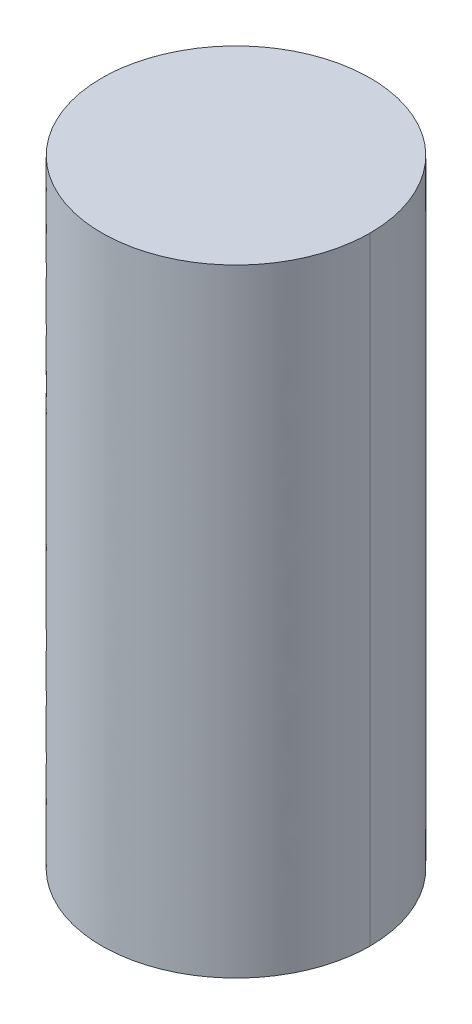
ISO-10303-21;
HEADER;
FILE_DESCRIPTION(('STEP AP214'),'2;1');
FILE_NAME('part.step','',(''),(''),'','','');
FILE_SCHEMA(('AUTOMOTIVE_DESIGN { 1 0 10303 214 1 1 1 1 }'));
ENDSEC;
DATA;
#1=APPLICATION_CONTEXT('core data for automotive mechanical design processes');
#2=APPLICATION_PROTOCOL_DEFINITION('international standard','automotive_design',2000,#1);
#3=PRODUCT_CONTEXT('',#1,'mechanical');
#4=PRODUCT('Part','Part','',(#3));
#5=PRODUCT_RELATED_PRODUCT_CATEGORY('part','',(#4));
#6=PRODUCT_DEFINITION_FORMATION('','',#4);
#7=PRODUCT_DEFINITION_CONTEXT('part definition',#1,'design');
#8=PRODUCT_DEFINITION('design','',#6,#7);
#9=PRODUCT_DEFINITION_SHAPE('','',#8);
#10=(LENGTH_UNIT() NAMED_UNIT(*) SI_UNIT(.MILLI.,.METRE.));
#11=(NAMED_UNIT(*) PLANE_ANGLE_UNIT() SI_UNIT($,.RADIAN.));
#12=(NAMED_UNIT(*) SI_UNIT($,.STERADIAN.) SOLID_ANGLE_UNIT());
#13=UNCERTAINTY_MEASURE_WITH_UNIT(LENGTH_MEASURE(1.E-05),#10,'distance_accuracy_value','');
#14=(GEOMETRIC_REPRESENTATION_CONTEXT(3) GLOBAL_UNCERTAINTY_ASSIGNED_CONTEXT((#13)) GLOBAL_UNIT_ASSIGNED_CONTEXT((#10,
#11,#12)) REPRESENTATION_CONTEXT('',''));
#15=CARTESIAN_POINT('',(0.,0.,0.));
#16=DIRECTION('',(0.,0.,1.));
#17=DIRECTION('',(1.,0.,0.));
#18=AXIS2_PLACEMENT_3D('',#15,#16,#17);
#19=CARTESIAN_POINT('',(11.1823500000002,-1.778,34.1122000000042));
#20=CARTESIAN_POINT('',(11.1823500000009,-1.778,33.8954315072629));
#21=CARTESIAN_POINT('',(11.1136845068532,-1.778,33.4618945217756));
#22=CARTESIAN_POINT('',(10.8147717922826,-1.778,32.8752454325882));
#23=CARTESIAN_POINT('',(10.3492048043684,-1.778,32.4096782432774));
#24=CARTESIAN_POINT('',(9.7625544948926,-1.778,32.1107651139776));
#25=CARTESIAN_POINT('',(9.1122536963604,-1.778,32.0077687344996));
#26=CARTESIAN_POINT('',(8.461930719615,-1.778,32.110759948024));
#27=CARTESIAN_POINT('',(7.8753469448042,-1.778,32.4096989071426));
#28=CARTESIAN_POINT('',(7.4095359965448,-1.778,32.8751679431064));
#29=CARTESIAN_POINT('',(7.1115325887174,-1.778,33.462183815783));
#30=CARTESIAN_POINT('',(7.0406049177714,-1.778,33.8948081475354));
#31=CARTESIAN_POINT('',(7.04215,-1.778,34.1122));
#32=(BOUNDED_CURVE() B_SPLINE_CURVE(3,(#19,#20,#21,#22,#23,#24,#25,#26,#27,#28,#29,#30,#31),
.UNSPECIFIED.,.F.,.F.) B_SPLINE_CURVE_WITH_KNOTS((4,1,1,1,1,1,1,1,1,1,4),(0.254988178016,
0.280486995817,0.305985813619,0.33148463142,0.356983449222,0.382482267023,0.407981084825,
0.433479902626,0.458978720428,0.48447753823,0.509976356031),
.UNSPECIFIED.) CURVE() GEOMETRIC_REPRESENTATION_ITEM() RATIONAL_B_SPLINE_CURVE((1.,1.,1.,1.,1.,
1.,1.,1.,1.,1.,1.,1.,1.)) REPRESENTATION_ITEM(''));
#33=DIRECTION('',(0.,-1.,0.));
#34=VECTOR('',#33,1.);
#35=SURFACE_OF_LINEAR_EXTRUSION('',#32,#34);
#36=DIRECTION('',(0.,-1.,0.));
#37=VECTOR('',#36,1.);
#38=CARTESIAN_POINT('',(7.04215,-1.778,34.1122));
#39=LINE('',#38,#37);
#40=CARTESIAN_POINT('',(7.04215,7.62,34.1122));
#41=VERTEX_POINT('',#40);
#42=CARTESIAN_POINT('',(7.04215,-1.905,34.1122));
#43=VERTEX_POINT('',#42);
#44=EDGE_CURVE('E11',#41,#43,#39,.T.);
#45=ORIENTED_EDGE('',*,*,#44,.F.);
#46=CARTESIAN_POINT('',(11.1823500000002,7.62,34.1122000000043));
#47=CARTESIAN_POINT('',(11.1823500000009,7.62,33.8954315072629));
#48=CARTESIAN_POINT('',(11.1136845068532,7.62,33.4618945217756));
#49=CARTESIAN_POINT('',(10.8147717922826,7.62,32.8752454325882));
#50=CARTESIAN_POINT('',(10.3492048043684,7.62,32.4096782432774));
#51=CARTESIAN_POINT('',(9.7625544948926,7.62,32.1107651139776));
#52=CARTESIAN_POINT('',(9.1122536963604,7.62,32.0077687344996));
#53=CARTESIAN_POINT('',(8.461930719615,7.62,32.110759948024));
#54=CARTESIAN_POINT('',(7.8753469448042,7.62,32.4096989071426));
#55=CARTESIAN_POINT('',(7.4095359965448,7.62,32.8751679431064));
#56=CARTESIAN_POINT('',(7.1115325887174,7.62,33.462183815783));
#57=CARTESIAN_POINT('',(7.0406049177714,7.62,33.8948081475354));
#58=CARTESIAN_POINT('',(7.04215,7.62,34.1122));
#59=(BOUNDED_CURVE() B_SPLINE_CURVE(3,(#46,#47,#48,#49,#50,#51,#52,#53,#54,#55,#56,#57,#58),
.UNSPECIFIED.,.F.,.F.) B_SPLINE_CURVE_WITH_KNOTS((4,1,1,1,1,1,1,1,1,1,4),(0.254988178016,
0.280486995817,0.305985813619,0.33148463142,0.356983449222,0.382482267023,0.407981084825,
0.433479902626,0.458978720428,0.48447753823,0.509976356031),
.UNSPECIFIED.) CURVE() GEOMETRIC_REPRESENTATION_ITEM() RATIONAL_B_SPLINE_CURVE((1.,1.,1.,1.,1.,
1.,1.,1.,1.,1.,1.,1.,1.)) REPRESENTATION_ITEM(''));
#60=CARTESIAN_POINT('',(11.1823500000002,7.62,34.1122000000043));
#61=VERTEX_POINT('',#60);
#62=EDGE_CURVE('E53',#61,#41,#59,.T.);
#63=ORIENTED_EDGE('',*,*,#62,.F.);
#64=DIRECTION('',(0.,-1.,0.));
#65=VECTOR('',#64,1.);
#66=CARTESIAN_POINT('',(11.1823500000002,-1.778,34.1122000000042));
#67=LINE('',#66,#65);
#68=CARTESIAN_POINT('',(11.1823500000002,-1.905,34.1122000000043));
#69=VERTEX_POINT('',#68);
#70=EDGE_CURVE('E28',#61,#69,#67,.T.);
#71=ORIENTED_EDGE('',*,*,#70,.T.);
#72=CARTESIAN_POINT('',(11.1823500000002,-1.905,34.1122000000043));
#73=CARTESIAN_POINT('',(11.1823500000009,-1.905,33.8954315072629));
#74=CARTESIAN_POINT('',(11.1136845068532,-1.905,33.4618945217756));
#75=CARTESIAN_POINT('',(10.8147717922826,-1.905,32.8752454325882));
#76=CARTESIAN_POINT('',(10.3492048043684,-1.905,32.4096782432774));
#77=CARTESIAN_POINT('',(9.7625544948926,-1.905,32.1107651139776));
#78=CARTESIAN_POINT('',(9.1122536963604,-1.905,32.0077687344996));
#79=CARTESIAN_POINT('',(8.461930719615,-1.905,32.110759948024));
#80=CARTESIAN_POINT('',(7.8753469448042,-1.905,32.4096989071426));
#81=CARTESIAN_POINT('',(7.4095359965448,-1.905,32.8751679431064));
#82=CARTESIAN_POINT('',(7.1115325887174,-1.905,33.462183815783));
#83=CARTESIAN_POINT('',(7.0406049177714,-1.905,33.8948081475354));
#84=CARTESIAN_POINT('',(7.04215,-1.905,34.1122));
#85=(BOUNDED_CURVE() B_SPLINE_CURVE(3,(#72,#73,#74,#75,#76,#77,#78,#79,#80,#81,#82,#83,#84),
.UNSPECIFIED.,.F.,.F.) B_SPLINE_CURVE_WITH_KNOTS((4,1,1,1,1,1,1,1,1,1,4),(0.254988178016,
0.280486995817,0.305985813619,0.33148463142,0.356983449222,0.382482267023,0.407981084825,
0.433479902626,0.458978720428,0.48447753823,0.509976356031),
.UNSPECIFIED.) CURVE() GEOMETRIC_REPRESENTATION_ITEM() RATIONAL_B_SPLINE_CURVE((1.,1.,1.,1.,1.,
1.,1.,1.,1.,1.,1.,1.,1.)) REPRESENTATION_ITEM(''));
#86=EDGE_CURVE('E52',#43,#69,#85,.F.);
#87=ORIENTED_EDGE('',*,*,#86,.F.);
#88=EDGE_LOOP('',(#45,#63,#71,#87));
#89=FACE_BOUND('',#88,.T.);
#90=ADVANCED_FACE('F17',(#89),#35,.F.);
#91=CARTESIAN_POINT('',(9.1136162488042,-1.905,34.1122));
#92=DIRECTION('',(0.,1.,0.));
#93=DIRECTION('',(0.,0.,1.));
#94=AXIS2_PLACEMENT_3D('',#91,#92,#93);
#95=PLANE('',#94);
#96=ORIENTED_EDGE('',*,*,#86,.T.);
#97=CARTESIAN_POINT('',(7.04215,-1.905,34.1122));
#98=CARTESIAN_POINT('',(7.0406049177714,-1.905,34.3295918524646));
#99=CARTESIAN_POINT('',(7.1115325887174,-1.905,34.762216184217));
#100=CARTESIAN_POINT('',(7.4095359965448,-1.905,35.3492320568936));
#101=CARTESIAN_POINT('',(7.8753469448042,-1.905,35.8147010928574));
#102=CARTESIAN_POINT('',(8.461930719615,-1.905,36.113640051976));
#103=CARTESIAN_POINT('',(9.1122536963604,-1.905,36.2166312655004));
#104=CARTESIAN_POINT('',(9.7625544948926,-1.905,36.1136348860224));
#105=CARTESIAN_POINT('',(10.3492048043684,-1.905,35.8147217567226));
#106=CARTESIAN_POINT('',(10.8147717922826,-1.905,35.3491545674118));
#107=CARTESIAN_POINT('',(11.1136845068492,-1.905,34.762505478232));
#108=CARTESIAN_POINT('',(11.1823499999996,-1.905,34.3289684927456));
#109=CARTESIAN_POINT('',(11.1823500000002,-1.905,34.1122000000042));
#110=(BOUNDED_CURVE() B_SPLINE_CURVE(3,(#97,#98,#99,#100,#101,#102,#103,#104,#105,#106,#107,
#108,#109),.UNSPECIFIED.,.F.,.F.) B_SPLINE_CURVE_WITH_KNOTS((4,1,1,1,1,1,1,1,1,1,4),(0.,
0.02549881780156,0.05099763560312,0.07649645340467,0.101995271206,0.127494089008,0.152992906809,
0.178491724611,0.203990542412,0.229489360214,0.254988178016),
.UNSPECIFIED.) CURVE() GEOMETRIC_REPRESENTATION_ITEM() RATIONAL_B_SPLINE_CURVE((1.,1.,1.,1.,1.,
1.,1.,1.,1.,1.,1.,1.,1.)) REPRESENTATION_ITEM(''));
#111=EDGE_CURVE('E21',#69,#43,#110,.F.);
#112=ORIENTED_EDGE('',*,*,#111,.T.);
#113=EDGE_LOOP('',(#96,#112));
#114=FACE_BOUND('',#113,.T.);
#115=ADVANCED_FACE('F51',(#114),#95,.F.);
#116=CARTESIAN_POINT('',(9.1136162488042,7.62,34.1122));
#117=DIRECTION('',(0.,1.,0.));
#118=DIRECTION('',(0.,0.,1.));
#119=AXIS2_PLACEMENT_3D('',#116,#117,#118);
#120=PLANE('',#119);
#121=CARTESIAN_POINT('',(7.04215,7.62,34.1122));
#122=CARTESIAN_POINT('',(7.0406049177714,7.62,34.3295918524646));
#123=CARTESIAN_POINT('',(7.1115325887174,7.62,34.762216184217));
#124=CARTESIAN_POINT('',(7.4095359965448,7.62,35.3492320568936));
#125=CARTESIAN_POINT('',(7.8753469448042,7.62,35.8147010928574));
#126=CARTESIAN_POINT('',(8.461930719615,7.62,36.113640051976));
#127=CARTESIAN_POINT('',(9.1122536963604,7.62,36.2166312655004));
#128=CARTESIAN_POINT('',(9.7625544948926,7.62,36.1136348860224));
#129=CARTESIAN_POINT('',(10.3492048043684,7.62,35.8147217567226));
#130=CARTESIAN_POINT('',(10.8147717922826,7.62,35.3491545674118));
#131=CARTESIAN_POINT('',(11.1136845068492,7.62,34.762505478232));
#132=CARTESIAN_POINT('',(11.1823499999996,7.62,34.3289684927456));
#133=CARTESIAN_POINT('',(11.1823500000002,7.62,34.1122000000042));
#134=(BOUNDED_CURVE() B_SPLINE_CURVE(3,(#121,#122,#123,#124,#125,#126,#127,#128,#129,#130,#131,
#132,#133),.UNSPECIFIED.,.F.,.F.) B_SPLINE_CURVE_WITH_KNOTS((4,1,1,1,1,1,1,1,1,1,4),(0.,
0.02549881780156,0.05099763560312,0.07649645340467,0.101995271206,0.127494089008,0.152992906809,
0.178491724611,0.203990542412,0.229489360214,0.254988178016),
.UNSPECIFIED.) CURVE() GEOMETRIC_REPRESENTATION_ITEM() RATIONAL_B_SPLINE_CURVE((1.,1.,1.,1.,1.,
1.,1.,1.,1.,1.,1.,1.,1.)) REPRESENTATION_ITEM(''));
#135=EDGE_CURVE('E48',#41,#61,#134,.T.);
#136=ORIENTED_EDGE('',*,*,#135,.T.);
#137=ORIENTED_EDGE('',*,*,#62,.T.);
#138=EDGE_LOOP('',(#136,#137));
#139=FACE_BOUND('',#138,.T.);
#140=ADVANCED_FACE('F87',(#139),#120,.T.);
#141=CARTESIAN_POINT('',(7.04215,-1.778,34.1122));
#142=CARTESIAN_POINT('',(7.0406049177714,-1.778,34.3295918524646));
#143=CARTESIAN_POINT('',(7.1115325887174,-1.778,34.762216184217));
#144=CARTESIAN_POINT('',(7.4095359965448,-1.778,35.3492320568936));
#145=CARTESIAN_POINT('',(7.8753469448042,-1.778,35.8147010928574));
#146=CARTESIAN_POINT('',(8.461930719615,-1.778,36.113640051976));
#147=CARTESIAN_POINT('',(9.1122536963604,-1.778,36.2166312655004));
#148=CARTESIAN_POINT('',(9.7625544948926,-1.778,36.1136348860224));
#149=CARTESIAN_POINT('',(10.3492048043684,-1.778,35.8147217567226));
#150=CARTESIAN_POINT('',(10.8147717922826,-1.778,35.3491545674118));
#151=CARTESIAN_POINT('',(11.1136845068492,-1.778,34.762505478232));
#152=CARTESIAN_POINT('',(11.1823499999996,-1.778,34.3289684927456));
#153=CARTESIAN_POINT('',(11.1823500000002,-1.778,34.1122000000043));
#154=(BOUNDED_CURVE() B_SPLINE_CURVE(3,(#141,#142,#143,#144,#145,#146,#147,#148,#149,#150,#151,
#152,#153),.UNSPECIFIED.,.F.,.F.) B_SPLINE_CURVE_WITH_KNOTS((4,1,1,1,1,1,1,1,1,1,4),(0.,
0.02549881780156,0.05099763560312,0.07649645340467,0.101995271206,0.127494089008,0.152992906809,
0.178491724611,0.203990542412,0.229489360214,0.254988178016),
.UNSPECIFIED.) CURVE() GEOMETRIC_REPRESENTATION_ITEM() RATIONAL_B_SPLINE_CURVE((1.,1.,1.,1.,1.,
1.,1.,1.,1.,1.,1.,1.,1.)) REPRESENTATION_ITEM(''));
#155=DIRECTION('',(0.,-1.,0.));
#156=VECTOR('',#155,1.);
#157=SURFACE_OF_LINEAR_EXTRUSION('',#154,#156);
#158=ORIENTED_EDGE('',*,*,#135,.F.);
#159=ORIENTED_EDGE('',*,*,#44,.T.);
#160=ORIENTED_EDGE('',*,*,#111,.F.);
#161=ORIENTED_EDGE('',*,*,#70,.F.);
#162=EDGE_LOOP('',(#158,#159,#160,#161));
#163=FACE_BOUND('',#162,.T.);
#164=ADVANCED_FACE('F45',(#163),#157,.F.);
#165=CLOSED_SHELL('',(#90,#115,#140,#164));
#166=MANIFOLD_SOLID_BREP('B1',#165);
#167=ADVANCED_BREP_SHAPE_REPRESENTATION('',(#18,#166),#14);
#168=SHAPE_DEFINITION_REPRESENTATION(#9,#167);
ENDSEC;
END-ISO-10303-21;
